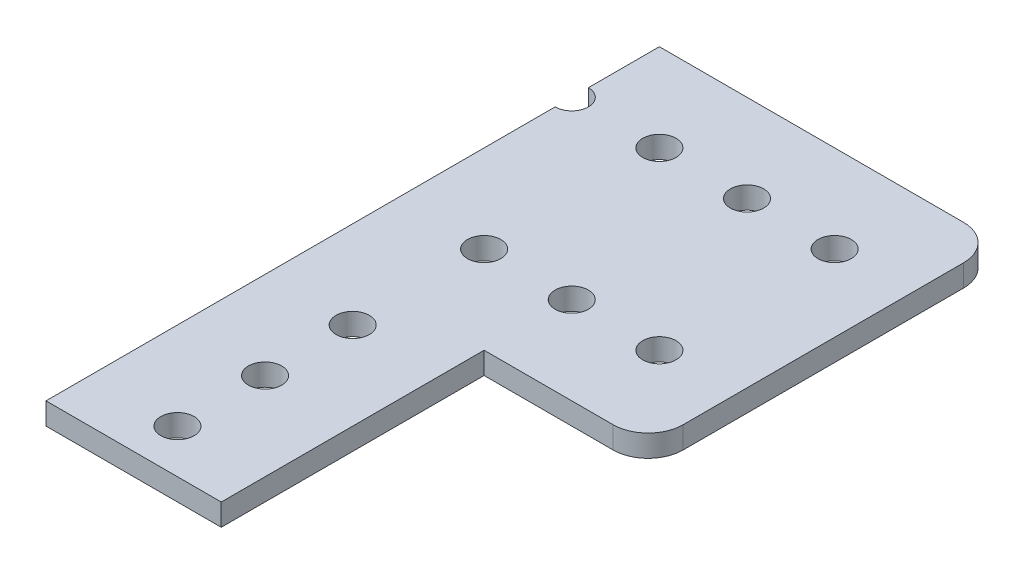
ISO-10303-21;
HEADER;
FILE_DESCRIPTION(('STEP AP214'),'2;1');
FILE_NAME('part.step','',(''),(''),'','','');
FILE_SCHEMA(('AUTOMOTIVE_DESIGN { 1 0 10303 214 1 1 1 1 }'));
ENDSEC;
DATA;
#1=APPLICATION_CONTEXT('core data for automotive mechanical design processes');
#2=APPLICATION_PROTOCOL_DEFINITION('international standard','automotive_design',2000,#1);
#3=PRODUCT_CONTEXT('',#1,'mechanical');
#4=PRODUCT('Part','Part','',(#3));
#5=PRODUCT_RELATED_PRODUCT_CATEGORY('part','',(#4));
#6=PRODUCT_DEFINITION_FORMATION('','',#4);
#7=PRODUCT_DEFINITION_CONTEXT('part definition',#1,'design');
#8=PRODUCT_DEFINITION('design','',#6,#7);
#9=PRODUCT_DEFINITION_SHAPE('','',#8);
#10=(LENGTH_UNIT() NAMED_UNIT(*) SI_UNIT(.MILLI.,.METRE.));
#11=(NAMED_UNIT(*) PLANE_ANGLE_UNIT() SI_UNIT($,.RADIAN.));
#12=(NAMED_UNIT(*) SI_UNIT($,.STERADIAN.) SOLID_ANGLE_UNIT());
#13=UNCERTAINTY_MEASURE_WITH_UNIT(LENGTH_MEASURE(1.E-05),#10,'distance_accuracy_value','');
#14=(GEOMETRIC_REPRESENTATION_CONTEXT(3) GLOBAL_UNCERTAINTY_ASSIGNED_CONTEXT((#13)) GLOBAL_UNIT_ASSIGNED_CONTEXT((#10,
#11,#12)) REPRESENTATION_CONTEXT('',''));
#15=CARTESIAN_POINT('',(0.,0.,0.));
#16=DIRECTION('',(0.,0.,1.));
#17=DIRECTION('',(1.,0.,0.));
#18=AXIS2_PLACEMENT_3D('',#15,#16,#17);
#19=CARTESIAN_POINT('',(0.,3.175,0.));
#20=DIRECTION('',(1.,0.,0.));
#21=DIRECTION('',(0.,0.,-1.));
#22=AXIS2_PLACEMENT_3D('',#19,#20,#21);
#23=PLANE('',#22);
#24=DIRECTION('',(0.,0.,1.));
#25=VECTOR('',#24,1.);
#26=CARTESIAN_POINT('',(0.,0.,0.));
#27=LINE('',#26,#25);
#28=CARTESIAN_POINT('',(0.,0.,-86.487000321718));
#29=VERTEX_POINT('',#28);
#30=CARTESIAN_POINT('',(0.,0.,-12.7));
#31=VERTEX_POINT('',#30);
#32=EDGE_CURVE('E220',#29,#31,#27,.T.);
#33=ORIENTED_EDGE('',*,*,#32,.T.);
#34=DIRECTION('',(0.,1.,0.));
#35=VECTOR('',#34,1.);
#36=CARTESIAN_POINT('',(0.,0.,-12.7));
#37=LINE('',#36,#35);
#38=CARTESIAN_POINT('',(0.,3.175,-12.7));
#39=VERTEX_POINT('',#38);
#40=EDGE_CURVE('E223',#31,#39,#37,.T.);
#41=ORIENTED_EDGE('',*,*,#40,.T.);
#42=DIRECTION('',(0.,0.,1.));
#43=VECTOR('',#42,1.);
#44=CARTESIAN_POINT('',(0.,3.175,0.));
#45=LINE('',#44,#43);
#46=CARTESIAN_POINT('',(0.,3.175,-86.487000321718));
#47=VERTEX_POINT('',#46);
#48=EDGE_CURVE('E48',#47,#39,#45,.T.);
#49=ORIENTED_EDGE('',*,*,#48,.F.);
#50=DIRECTION('',(0.,1.,0.));
#51=VECTOR('',#50,1.);
#52=CARTESIAN_POINT('',(0.,0.,-86.487000321718));
#53=LINE('',#52,#51);
#54=EDGE_CURVE('E41',#29,#47,#53,.T.);
#55=ORIENTED_EDGE('',*,*,#54,.F.);
#56=EDGE_LOOP('',(#33,#41,#49,#55));
#57=FACE_BOUND('',#56,.T.);
#58=ADVANCED_FACE('F33',(#57),#23,.F.);
#59=CARTESIAN_POINT('',(25.4,3.175,0.));
#60=DIRECTION('',(-1.,0.,0.));
#61=DIRECTION('',(0.,0.,1.));
#62=AXIS2_PLACEMENT_3D('',#59,#60,#61);
#63=PLANE('',#62);
#64=DIRECTION('',(0.,0.,-1.));
#65=VECTOR('',#64,1.);
#66=CARTESIAN_POINT('',(25.4,3.175,0.));
#67=LINE('',#66,#65);
#68=CARTESIAN_POINT('',(25.4,3.175,-12.7));
#69=VERTEX_POINT('',#68);
#70=CARTESIAN_POINT('',(25.4,3.175,-50.8));
#71=VERTEX_POINT('',#70);
#72=EDGE_CURVE('E134',#69,#71,#67,.T.);
#73=ORIENTED_EDGE('',*,*,#72,.F.);
#74=DIRECTION('',(0.,1.,0.));
#75=VECTOR('',#74,1.);
#76=CARTESIAN_POINT('',(25.4,0.,-12.7));
#77=LINE('',#76,#75);
#78=CARTESIAN_POINT('',(25.4,0.,-12.7));
#79=VERTEX_POINT('',#78);
#80=EDGE_CURVE('E437',#79,#69,#77,.T.);
#81=ORIENTED_EDGE('',*,*,#80,.F.);
#82=DIRECTION('',(0.,0.,-1.));
#83=VECTOR('',#82,1.);
#84=CARTESIAN_POINT('',(25.4,0.,0.));
#85=LINE('',#84,#83);
#86=CARTESIAN_POINT('',(25.4,0.,-50.8));
#87=VERTEX_POINT('',#86);
#88=EDGE_CURVE('E222',#79,#87,#85,.T.);
#89=ORIENTED_EDGE('',*,*,#88,.T.);
#90=DIRECTION('',(0.,-1.,0.));
#91=VECTOR('',#90,1.);
#92=CARTESIAN_POINT('',(25.4,3.175,-50.8));
#93=LINE('',#92,#91);
#94=EDGE_CURVE('E141',#71,#87,#93,.T.);
#95=ORIENTED_EDGE('',*,*,#94,.F.);
#96=EDGE_LOOP('',(#73,#81,#89,#95));
#97=FACE_BOUND('',#96,.T.);
#98=ADVANCED_FACE('F253',(#97),#63,.F.);
#99=CARTESIAN_POINT('',(25.4,3.175,-50.8));
#100=DIRECTION('',(0.,0.,-1.));
#101=DIRECTION('',(-1.,0.,0.));
#102=AXIS2_PLACEMENT_3D('',#99,#100,#101);
#103=PLANE('',#102);
#104=DIRECTION('',(1.,0.,0.));
#105=VECTOR('',#104,1.);
#106=CARTESIAN_POINT('',(25.4,0.,-50.8));
#107=LINE('',#106,#105);
#108=CARTESIAN_POINT('',(44.0905660377358,0.,-50.8));
#109=VERTEX_POINT('',#108);
#110=EDGE_CURVE('E137',#87,#109,#107,.T.);
#111=ORIENTED_EDGE('',*,*,#110,.T.);
#112=DIRECTION('',(0.,-1.,0.));
#113=VECTOR('',#112,1.);
#114=CARTESIAN_POINT('',(44.0905660377358,3.175,-50.8));
#115=LINE('',#114,#113);
#116=CARTESIAN_POINT('',(44.0905660377358,3.175,-50.8));
#117=VERTEX_POINT('',#116);
#118=EDGE_CURVE('E158',#109,#117,#115,.F.);
#119=ORIENTED_EDGE('',*,*,#118,.T.);
#120=DIRECTION('',(1.,0.,0.));
#121=VECTOR('',#120,1.);
#122=CARTESIAN_POINT('',(25.4,3.175,-50.8));
#123=LINE('',#122,#121);
#124=EDGE_CURVE('E213',#71,#117,#123,.T.);
#125=ORIENTED_EDGE('',*,*,#124,.F.);
#126=ORIENTED_EDGE('',*,*,#94,.T.);
#127=EDGE_LOOP('',(#111,#119,#125,#126));
#128=FACE_BOUND('',#127,.T.);
#129=ADVANCED_FACE('F228',(#128),#103,.F.);
#130=CARTESIAN_POINT('',(49.1705660377358,3.175,-50.8));
#131=DIRECTION('',(-1.,0.,0.));
#132=DIRECTION('',(0.,0.,1.));
#133=AXIS2_PLACEMENT_3D('',#130,#131,#132);
#134=PLANE('',#133);
#135=DIRECTION('',(0.,0.,-1.));
#136=VECTOR('',#135,1.);
#137=CARTESIAN_POINT('',(49.1705660377358,3.175,-50.8));
#138=LINE('',#137,#136);
#139=CARTESIAN_POINT('',(49.1705660377358,3.175,-55.88));
#140=VERTEX_POINT('',#139);
#141=CARTESIAN_POINT('',(49.1705660377358,3.175,-96.52));
#142=VERTEX_POINT('',#141);
#143=EDGE_CURVE('E216',#140,#142,#138,.T.);
#144=ORIENTED_EDGE('',*,*,#143,.F.);
#145=DIRECTION('',(0.,-1.,0.));
#146=VECTOR('',#145,1.);
#147=CARTESIAN_POINT('',(49.1705660377358,3.175,-55.88));
#148=LINE('',#147,#146);
#149=CARTESIAN_POINT('',(49.1705660377358,0.,-55.88));
#150=VERTEX_POINT('',#149);
#151=EDGE_CURVE('E155',#140,#150,#148,.T.);
#152=ORIENTED_EDGE('',*,*,#151,.T.);
#153=DIRECTION('',(0.,0.,-1.));
#154=VECTOR('',#153,1.);
#155=CARTESIAN_POINT('',(49.1705660377358,0.,-50.8));
#156=LINE('',#155,#154);
#157=CARTESIAN_POINT('',(49.1705660377358,0.,-96.52));
#158=VERTEX_POINT('',#157);
#159=EDGE_CURVE('E132',#150,#158,#156,.T.);
#160=ORIENTED_EDGE('',*,*,#159,.T.);
#161=DIRECTION('',(0.,-1.,0.));
#162=VECTOR('',#161,1.);
#163=CARTESIAN_POINT('',(49.1705660377358,3.175,-96.52));
#164=LINE('',#163,#162);
#165=EDGE_CURVE('E153',#158,#142,#164,.F.);
#166=ORIENTED_EDGE('',*,*,#165,.T.);
#167=EDGE_LOOP('',(#144,#152,#160,#166));
#168=FACE_BOUND('',#167,.T.);
#169=ADVANCED_FACE('F239',(#168),#134,.F.);
#170=CARTESIAN_POINT('',(-27.0294339622642,3.175,-101.6));
#171=DIRECTION('',(0.,0.,1.));
#172=DIRECTION('',(1.,0.,0.));
#173=AXIS2_PLACEMENT_3D('',#170,#171,#172);
#174=PLANE('',#173);
#175=DIRECTION('',(-1.,0.,0.));
#176=VECTOR('',#175,1.);
#177=CARTESIAN_POINT('',(-27.0294339622642,0.,-101.6));
#178=LINE('',#177,#176);
#179=CARTESIAN_POINT('',(44.0905660377358,0.,-101.6));
#180=VERTEX_POINT('',#179);
#181=CARTESIAN_POINT('',(0.,0.,-101.6));
#182=VERTEX_POINT('',#181);
#183=EDGE_CURVE('E124',#180,#182,#178,.T.);
#184=ORIENTED_EDGE('',*,*,#183,.T.);
#185=DIRECTION('',(0.,1.,0.));
#186=VECTOR('',#185,1.);
#187=CARTESIAN_POINT('',(0.,0.,-101.6));
#188=LINE('',#187,#186);
#189=CARTESIAN_POINT('',(0.,3.175,-101.6));
#190=VERTEX_POINT('',#189);
#191=EDGE_CURVE('E109',#182,#190,#188,.T.);
#192=ORIENTED_EDGE('',*,*,#191,.T.);
#193=DIRECTION('',(-1.,0.,0.));
#194=VECTOR('',#193,1.);
#195=CARTESIAN_POINT('',(-27.0294339622642,3.175,-101.6));
#196=LINE('',#195,#194);
#197=CARTESIAN_POINT('',(44.0905660377358,3.175,-101.6));
#198=VERTEX_POINT('',#197);
#199=EDGE_CURVE('E145',#198,#190,#196,.T.);
#200=ORIENTED_EDGE('',*,*,#199,.F.);
#201=DIRECTION('',(0.,-1.,0.));
#202=VECTOR('',#201,1.);
#203=CARTESIAN_POINT('',(44.0905660377358,3.175,-101.6));
#204=LINE('',#203,#202);
#205=EDGE_CURVE('E131',#198,#180,#204,.T.);
#206=ORIENTED_EDGE('',*,*,#205,.T.);
#207=EDGE_LOOP('',(#184,#192,#200,#206));
#208=FACE_BOUND('',#207,.T.);
#209=ADVANCED_FACE('F129',(#208),#174,.F.);
#210=CARTESIAN_POINT('',(0.,3.175,0.));
#211=DIRECTION('',(0.,-1.,0.));
#212=DIRECTION('',(0.,0.,-1.));
#213=AXIS2_PLACEMENT_3D('',#210,#211,#212);
#214=PLANE('',#213);
#215=CARTESIAN_POINT('',(38.1012460377358,3.175,-63.5000000000002));
#216=DIRECTION('',(0.,1.,0.));
#217=DIRECTION('',(0.,0.,1.));
#218=AXIS2_PLACEMENT_3D('',#215,#216,#217);
#219=CIRCLE('',#218,2.413);
#220=CARTESIAN_POINT('',(38.1012460377358,3.175,-61.0870000000002));
#221=VERTEX_POINT('',#220);
#222=EDGE_CURVE('E117',#221,#221,#219,.T.);
#223=ORIENTED_EDGE('',*,*,#222,.F.);
#224=EDGE_LOOP('',(#223));
#225=FACE_BOUND('',#224,.T.);
#226=CARTESIAN_POINT('',(25.4012460377358,3.175,-63.5000000000002));
#227=DIRECTION('',(0.,1.,0.));
#228=DIRECTION('',(0.,0.,1.));
#229=AXIS2_PLACEMENT_3D('',#226,#227,#228);
#230=CIRCLE('',#229,2.41299999999999);
#231=CARTESIAN_POINT('',(25.4012460377358,3.175,-61.0870000000002));
#232=VERTEX_POINT('',#231);
#233=EDGE_CURVE('E453',#232,#232,#230,.T.);
#234=ORIENTED_EDGE('',*,*,#233,.F.);
#235=EDGE_LOOP('',(#234));
#236=FACE_BOUND('',#235,.T.);
#237=CARTESIAN_POINT('',(12.7012460377358,3.175,-63.5000000000002));
#238=DIRECTION('',(0.,1.,0.));
#239=DIRECTION('',(0.,0.,1.));
#240=AXIS2_PLACEMENT_3D('',#237,#238,#239);
#241=CIRCLE('',#240,2.413);
#242=CARTESIAN_POINT('',(12.7012460377358,3.175,-61.0870000000002));
#243=VERTEX_POINT('',#242);
#244=EDGE_CURVE('E447',#243,#243,#241,.T.);
#245=ORIENTED_EDGE('',*,*,#244,.F.);
#246=EDGE_LOOP('',(#245));
#247=FACE_BOUND('',#246,.T.);
#248=CARTESIAN_POINT('',(12.7,3.175,-19.05));
#249=DIRECTION('',(0.,1.,0.));
#250=DIRECTION('',(0.,0.,1.));
#251=AXIS2_PLACEMENT_3D('',#248,#249,#250);
#252=CIRCLE('',#251,2.413);
#253=CARTESIAN_POINT('',(12.7,3.175,-16.637));
#254=VERTEX_POINT('',#253);
#255=EDGE_CURVE('E198',#254,#254,#252,.T.);
#256=ORIENTED_EDGE('',*,*,#255,.F.);
#257=EDGE_LOOP('',(#256));
#258=FACE_BOUND('',#257,.T.);
#259=CARTESIAN_POINT('',(12.7,3.175,-31.75));
#260=DIRECTION('',(0.,1.,0.));
#261=DIRECTION('',(0.,0.,1.));
#262=AXIS2_PLACEMENT_3D('',#259,#260,#261);
#263=CIRCLE('',#262,2.413);
#264=CARTESIAN_POINT('',(12.7,3.175,-29.337));
#265=VERTEX_POINT('',#264);
#266=EDGE_CURVE('E204',#265,#265,#263,.T.);
#267=ORIENTED_EDGE('',*,*,#266,.F.);
#268=EDGE_LOOP('',(#267));
#269=FACE_BOUND('',#268,.T.);
#270=CARTESIAN_POINT('',(12.7,3.175,-44.45));
#271=DIRECTION('',(0.,1.,0.));
#272=DIRECTION('',(0.,0.,1.));
#273=AXIS2_PLACEMENT_3D('',#270,#271,#272);
#274=CIRCLE('',#273,2.413);
#275=CARTESIAN_POINT('',(12.7,3.175,-42.037));
#276=VERTEX_POINT('',#275);
#277=EDGE_CURVE('E172',#276,#276,#274,.T.);
#278=ORIENTED_EDGE('',*,*,#277,.F.);
#279=EDGE_LOOP('',(#278));
#280=FACE_BOUND('',#279,.T.);
#281=ORIENTED_EDGE('',*,*,#199,.T.);
#282=DIRECTION('',(0.,0.,-1.));
#283=VECTOR('',#282,1.);
#284=CARTESIAN_POINT('',(0.,3.175,-50.8));
#285=LINE('',#284,#283);
#286=CARTESIAN_POINT('',(0.,3.175,-91.3129996782824));
#287=VERTEX_POINT('',#286);
#288=EDGE_CURVE('E112',#287,#190,#285,.T.);
#289=ORIENTED_EDGE('',*,*,#288,.F.);
#290=CARTESIAN_POINT('',(0.00124603773582824,3.175,-88.9000000000002));
#291=DIRECTION('',(0.,1.,0.));
#292=DIRECTION('',(0.,0.,1.));
#293=AXIS2_PLACEMENT_3D('',#290,#291,#292);
#294=CIRCLE('',#293,2.413);
#295=EDGE_CURVE('E164',#47,#287,#294,.T.);
#296=ORIENTED_EDGE('',*,*,#295,.F.);
#297=ORIENTED_EDGE('',*,*,#48,.T.);
#298=DIRECTION('',(-1.,0.,0.));
#299=VECTOR('',#298,1.);
#300=CARTESIAN_POINT('',(0.,3.175,-12.7));
#301=LINE('',#300,#299);
#302=EDGE_CURVE('E197',#69,#39,#301,.T.);
#303=ORIENTED_EDGE('',*,*,#302,.F.);
#304=ORIENTED_EDGE('',*,*,#72,.T.);
#305=ORIENTED_EDGE('',*,*,#124,.T.);
#306=CARTESIAN_POINT('',(44.0905660377358,3.175,-55.88));
#307=DIRECTION('',(0.,-1.,0.));
#308=DIRECTION('',(0.,0.,-1.));
#309=AXIS2_PLACEMENT_3D('',#306,#307,#308);
#310=CIRCLE('',#309,5.08);
#311=EDGE_CURVE('E151',#117,#140,#310,.F.);
#312=ORIENTED_EDGE('',*,*,#311,.T.);
#313=ORIENTED_EDGE('',*,*,#143,.T.);
#314=CARTESIAN_POINT('',(44.0905660377358,3.175,-96.52));
#315=DIRECTION('',(0.,-1.,0.));
#316=DIRECTION('',(0.,0.,-1.));
#317=AXIS2_PLACEMENT_3D('',#314,#315,#316);
#318=CIRCLE('',#317,5.08);
#319=EDGE_CURVE('E149',#142,#198,#318,.F.);
#320=ORIENTED_EDGE('',*,*,#319,.T.);
#321=EDGE_LOOP('',(#281,#289,#296,#297,#303,#304,#305,#312,#313,#320));
#322=FACE_BOUND('',#321,.T.);
#323=CARTESIAN_POINT('',(12.7012460377358,3.175,-88.9000000000002));
#324=DIRECTION('',(0.,1.,0.));
#325=DIRECTION('',(0.,0.,1.));
#326=AXIS2_PLACEMENT_3D('',#323,#324,#325);
#327=CIRCLE('',#326,2.413);
#328=CARTESIAN_POINT('',(12.7012460377358,3.175,-86.4870000000002));
#329=VERTEX_POINT('',#328);
#330=EDGE_CURVE('E175',#329,#329,#327,.T.);
#331=ORIENTED_EDGE('',*,*,#330,.F.);
#332=EDGE_LOOP('',(#331));
#333=FACE_BOUND('',#332,.T.);
#334=CARTESIAN_POINT('',(25.4012460377358,3.175,-88.9000000000002));
#335=DIRECTION('',(0.,1.,0.));
#336=DIRECTION('',(0.,0.,1.));
#337=AXIS2_PLACEMENT_3D('',#334,#335,#336);
#338=CIRCLE('',#337,2.41299999999999);
#339=CARTESIAN_POINT('',(25.4012460377358,3.175,-86.4870000000002));
#340=VERTEX_POINT('',#339);
#341=EDGE_CURVE('E184',#340,#340,#338,.T.);
#342=ORIENTED_EDGE('',*,*,#341,.F.);
#343=EDGE_LOOP('',(#342));
#344=FACE_BOUND('',#343,.T.);
#345=CARTESIAN_POINT('',(38.1012460377358,3.175,-88.9000000000002));
#346=DIRECTION('',(0.,1.,0.));
#347=DIRECTION('',(0.,0.,1.));
#348=AXIS2_PLACEMENT_3D('',#345,#346,#347);
#349=CIRCLE('',#348,2.41299999999999);
#350=CARTESIAN_POINT('',(38.1012460377358,3.175,-86.4870000000002));
#351=VERTEX_POINT('',#350);
#352=EDGE_CURVE('E190',#351,#351,#349,.T.);
#353=ORIENTED_EDGE('',*,*,#352,.F.);
#354=EDGE_LOOP('',(#353));
#355=FACE_BOUND('',#354,.T.);
#356=ADVANCED_FACE('F167',(#225,#236,#247,#258,#269,#280,#322,#333,#344,#355),#214,.F.);
#357=CARTESIAN_POINT('',(0.,0.,0.));
#358=DIRECTION('',(0.,-1.,0.));
#359=DIRECTION('',(0.,0.,-1.));
#360=AXIS2_PLACEMENT_3D('',#357,#358,#359);
#361=PLANE('',#360);
#362=DIRECTION('',(0.,0.,-1.));
#363=VECTOR('',#362,1.);
#364=CARTESIAN_POINT('',(0.,0.,-50.8));
#365=LINE('',#364,#363);
#366=CARTESIAN_POINT('',(0.,0.,-91.3129996782824));
#367=VERTEX_POINT('',#366);
#368=EDGE_CURVE('E56',#367,#182,#365,.T.);
#369=ORIENTED_EDGE('',*,*,#368,.T.);
#370=ORIENTED_EDGE('',*,*,#183,.F.);
#371=CARTESIAN_POINT('',(44.0905660377358,0.,-96.52));
#372=DIRECTION('',(0.,-1.,0.));
#373=DIRECTION('',(0.,0.,-1.));
#374=AXIS2_PLACEMENT_3D('',#371,#372,#373);
#375=CIRCLE('',#374,5.08);
#376=EDGE_CURVE('E144',#180,#158,#375,.T.);
#377=ORIENTED_EDGE('',*,*,#376,.T.);
#378=ORIENTED_EDGE('',*,*,#159,.F.);
#379=CARTESIAN_POINT('',(44.0905660377358,0.,-55.88));
#380=DIRECTION('',(0.,-1.,0.));
#381=DIRECTION('',(0.,0.,-1.));
#382=AXIS2_PLACEMENT_3D('',#379,#380,#381);
#383=CIRCLE('',#382,5.08);
#384=EDGE_CURVE('E147',#150,#109,#383,.T.);
#385=ORIENTED_EDGE('',*,*,#384,.T.);
#386=ORIENTED_EDGE('',*,*,#110,.F.);
#387=ORIENTED_EDGE('',*,*,#88,.F.);
#388=DIRECTION('',(-1.,0.,0.));
#389=VECTOR('',#388,1.);
#390=CARTESIAN_POINT('',(0.,0.,-12.7));
#391=LINE('',#390,#389);
#392=EDGE_CURVE('E439',#79,#31,#391,.T.);
#393=ORIENTED_EDGE('',*,*,#392,.T.);
#394=ORIENTED_EDGE('',*,*,#32,.F.);
#395=CARTESIAN_POINT('',(0.00124603773582824,0.,-88.9000000000002));
#396=DIRECTION('',(0.,1.,0.));
#397=DIRECTION('',(0.,0.,1.));
#398=AXIS2_PLACEMENT_3D('',#395,#396,#397);
#399=CIRCLE('',#398,2.413);
#400=EDGE_CURVE('E126',#29,#367,#399,.T.);
#401=ORIENTED_EDGE('',*,*,#400,.T.);
#402=EDGE_LOOP('',(#369,#370,#377,#378,#385,#386,#387,#393,#394,#401));
#403=FACE_BOUND('',#402,.T.);
#404=CARTESIAN_POINT('',(38.1012460377358,0.,-63.5000000000002));
#405=DIRECTION('',(0.,1.,0.));
#406=DIRECTION('',(0.,0.,1.));
#407=AXIS2_PLACEMENT_3D('',#404,#405,#406);
#408=CIRCLE('',#407,2.413);
#409=CARTESIAN_POINT('',(38.1012460377358,0.,-61.0870000000002));
#410=VERTEX_POINT('',#409);
#411=EDGE_CURVE('E456',#410,#410,#408,.T.);
#412=ORIENTED_EDGE('',*,*,#411,.T.);
#413=EDGE_LOOP('',(#412));
#414=FACE_BOUND('',#413,.T.);
#415=CARTESIAN_POINT('',(25.4012460377358,0.,-63.5000000000002));
#416=DIRECTION('',(0.,1.,0.));
#417=DIRECTION('',(0.,0.,1.));
#418=AXIS2_PLACEMENT_3D('',#415,#416,#417);
#419=CIRCLE('',#418,2.41299999999999);
#420=CARTESIAN_POINT('',(25.4012460377358,0.,-61.0870000000002));
#421=VERTEX_POINT('',#420);
#422=EDGE_CURVE('E450',#421,#421,#419,.T.);
#423=ORIENTED_EDGE('',*,*,#422,.T.);
#424=EDGE_LOOP('',(#423));
#425=FACE_BOUND('',#424,.T.);
#426=CARTESIAN_POINT('',(12.7012460377358,0.,-63.5000000000002));
#427=DIRECTION('',(0.,1.,0.));
#428=DIRECTION('',(0.,0.,1.));
#429=AXIS2_PLACEMENT_3D('',#426,#427,#428);
#430=CIRCLE('',#429,2.413);
#431=CARTESIAN_POINT('',(12.7012460377358,0.,-61.0870000000002));
#432=VERTEX_POINT('',#431);
#433=EDGE_CURVE('E193',#432,#432,#430,.T.);
#434=ORIENTED_EDGE('',*,*,#433,.T.);
#435=EDGE_LOOP('',(#434));
#436=FACE_BOUND('',#435,.T.);
#437=CARTESIAN_POINT('',(12.7,0.,-19.05));
#438=DIRECTION('',(0.,1.,0.));
#439=DIRECTION('',(0.,0.,1.));
#440=AXIS2_PLACEMENT_3D('',#437,#438,#439);
#441=CIRCLE('',#440,2.413);
#442=CARTESIAN_POINT('',(12.7,0.,-16.637));
#443=VERTEX_POINT('',#442);
#444=EDGE_CURVE('E194',#443,#443,#441,.T.);
#445=ORIENTED_EDGE('',*,*,#444,.T.);
#446=EDGE_LOOP('',(#445));
#447=FACE_BOUND('',#446,.T.);
#448=CARTESIAN_POINT('',(12.7,0.,-31.75));
#449=DIRECTION('',(0.,1.,0.));
#450=DIRECTION('',(0.,0.,1.));
#451=AXIS2_PLACEMENT_3D('',#448,#449,#450);
#452=CIRCLE('',#451,2.413);
#453=CARTESIAN_POINT('',(12.7,0.,-29.337));
#454=VERTEX_POINT('',#453);
#455=EDGE_CURVE('E201',#454,#454,#452,.T.);
#456=ORIENTED_EDGE('',*,*,#455,.T.);
#457=EDGE_LOOP('',(#456));
#458=FACE_BOUND('',#457,.T.);
#459=CARTESIAN_POINT('',(12.7,0.,-44.45));
#460=DIRECTION('',(0.,1.,0.));
#461=DIRECTION('',(0.,0.,1.));
#462=AXIS2_PLACEMENT_3D('',#459,#460,#461);
#463=CIRCLE('',#462,2.413);
#464=CARTESIAN_POINT('',(12.7,0.,-42.037));
#465=VERTEX_POINT('',#464);
#466=EDGE_CURVE('E207',#465,#465,#463,.T.);
#467=ORIENTED_EDGE('',*,*,#466,.T.);
#468=EDGE_LOOP('',(#467));
#469=FACE_BOUND('',#468,.T.);
#470=CARTESIAN_POINT('',(12.7012460377358,0.,-88.9000000000002));
#471=DIRECTION('',(0.,1.,0.));
#472=DIRECTION('',(0.,0.,1.));
#473=AXIS2_PLACEMENT_3D('',#470,#471,#472);
#474=CIRCLE('',#473,2.413);
#475=CARTESIAN_POINT('',(12.7012460377358,0.,-86.4870000000002));
#476=VERTEX_POINT('',#475);
#477=EDGE_CURVE('E170',#476,#476,#474,.T.);
#478=ORIENTED_EDGE('',*,*,#477,.T.);
#479=EDGE_LOOP('',(#478));
#480=FACE_BOUND('',#479,.T.);
#481=CARTESIAN_POINT('',(25.4012460377358,0.,-88.9000000000002));
#482=DIRECTION('',(0.,1.,0.));
#483=DIRECTION('',(0.,0.,1.));
#484=AXIS2_PLACEMENT_3D('',#481,#482,#483);
#485=CIRCLE('',#484,2.41299999999999);
#486=CARTESIAN_POINT('',(25.4012460377358,0.,-86.4870000000002));
#487=VERTEX_POINT('',#486);
#488=EDGE_CURVE('E181',#487,#487,#485,.T.);
#489=ORIENTED_EDGE('',*,*,#488,.T.);
#490=EDGE_LOOP('',(#489));
#491=FACE_BOUND('',#490,.T.);
#492=CARTESIAN_POINT('',(38.1012460377358,0.,-88.9000000000002));
#493=DIRECTION('',(0.,1.,0.));
#494=DIRECTION('',(0.,0.,1.));
#495=AXIS2_PLACEMENT_3D('',#492,#493,#494);
#496=CIRCLE('',#495,2.41299999999999);
#497=CARTESIAN_POINT('',(38.1012460377358,0.,-86.4870000000002));
#498=VERTEX_POINT('',#497);
#499=EDGE_CURVE('E187',#498,#498,#496,.T.);
#500=ORIENTED_EDGE('',*,*,#499,.T.);
#501=EDGE_LOOP('',(#500));
#502=FACE_BOUND('',#501,.T.);
#503=ADVANCED_FACE('F122',(#403,#414,#425,#436,#447,#458,#469,#480,#491,#502),#361,.T.);
#504=CARTESIAN_POINT('',(44.0905660377358,3.175,-55.88));
#505=DIRECTION('',(0.,-1.,0.));
#506=DIRECTION('',(0.,0.,-1.));
#507=AXIS2_PLACEMENT_3D('',#504,#505,#506);
#508=CYLINDRICAL_SURFACE('',#507,5.08);
#509=ORIENTED_EDGE('',*,*,#311,.F.);
#510=ORIENTED_EDGE('',*,*,#118,.F.);
#511=ORIENTED_EDGE('',*,*,#384,.F.);
#512=ORIENTED_EDGE('',*,*,#151,.F.);
#513=EDGE_LOOP('',(#509,#510,#511,#512));
#514=FACE_BOUND('',#513,.T.);
#515=ADVANCED_FACE('F234',(#514),#508,.T.);
#516=CARTESIAN_POINT('',(44.0905660377358,3.175,-96.52));
#517=DIRECTION('',(0.,-1.,0.));
#518=DIRECTION('',(0.,0.,-1.));
#519=AXIS2_PLACEMENT_3D('',#516,#517,#518);
#520=CYLINDRICAL_SURFACE('',#519,5.08);
#521=ORIENTED_EDGE('',*,*,#319,.F.);
#522=ORIENTED_EDGE('',*,*,#165,.F.);
#523=ORIENTED_EDGE('',*,*,#376,.F.);
#524=ORIENTED_EDGE('',*,*,#205,.F.);
#525=EDGE_LOOP('',(#521,#522,#523,#524));
#526=FACE_BOUND('',#525,.T.);
#527=ADVANCED_FACE('F35',(#526),#520,.T.);
#528=CARTESIAN_POINT('',(38.1012460377358,0.,-88.9000000000002));
#529=DIRECTION('',(0.,1.,0.));
#530=DIRECTION('',(0.,0.,1.));
#531=AXIS2_PLACEMENT_3D('',#528,#529,#530);
#532=CYLINDRICAL_SURFACE('',#531,2.41299999999999);
#533=ORIENTED_EDGE('',*,*,#499,.F.);
#534=EDGE_LOOP('',(#533));
#535=FACE_BOUND('',#534,.T.);
#536=ORIENTED_EDGE('',*,*,#352,.T.);
#537=EDGE_LOOP('',(#536));
#538=FACE_BOUND('',#537,.T.);
#539=ADVANCED_FACE('F244',(#535,#538),#532,.F.);
#540=CARTESIAN_POINT('',(25.4012460377358,0.,-88.9000000000002));
#541=DIRECTION('',(0.,1.,0.));
#542=DIRECTION('',(0.,0.,1.));
#543=AXIS2_PLACEMENT_3D('',#540,#541,#542);
#544=CYLINDRICAL_SURFACE('',#543,2.41299999999999);
#545=ORIENTED_EDGE('',*,*,#488,.F.);
#546=EDGE_LOOP('',(#545));
#547=FACE_BOUND('',#546,.T.);
#548=ORIENTED_EDGE('',*,*,#341,.T.);
#549=EDGE_LOOP('',(#548));
#550=FACE_BOUND('',#549,.T.);
#551=ADVANCED_FACE('F249',(#547,#550),#544,.F.);
#552=CARTESIAN_POINT('',(12.7012460377358,0.,-88.9000000000002));
#553=DIRECTION('',(0.,1.,0.));
#554=DIRECTION('',(0.,0.,1.));
#555=AXIS2_PLACEMENT_3D('',#552,#553,#554);
#556=CYLINDRICAL_SURFACE('',#555,2.413);
#557=ORIENTED_EDGE('',*,*,#477,.F.);
#558=EDGE_LOOP('',(#557));
#559=FACE_BOUND('',#558,.T.);
#560=ORIENTED_EDGE('',*,*,#330,.T.);
#561=EDGE_LOOP('',(#560));
#562=FACE_BOUND('',#561,.T.);
#563=ADVANCED_FACE('F287',(#559,#562),#556,.F.);
#564=CARTESIAN_POINT('',(0.00124603773582824,0.,-88.9000000000002));
#565=DIRECTION('',(0.,1.,0.));
#566=DIRECTION('',(0.,0.,1.));
#567=AXIS2_PLACEMENT_3D('',#564,#565,#566);
#568=CYLINDRICAL_SURFACE('',#567,2.413);
#569=ORIENTED_EDGE('',*,*,#295,.T.);
#570=DIRECTION('',(0.,1.,0.));
#571=VECTOR('',#570,1.);
#572=CARTESIAN_POINT('',(0.,0.,-91.3129996782824));
#573=LINE('',#572,#571);
#574=EDGE_CURVE('E11',#287,#367,#573,.F.);
#575=ORIENTED_EDGE('',*,*,#574,.T.);
#576=ORIENTED_EDGE('',*,*,#400,.F.);
#577=ORIENTED_EDGE('',*,*,#54,.T.);
#578=EDGE_LOOP('',(#569,#575,#576,#577));
#579=FACE_BOUND('',#578,.T.);
#580=ADVANCED_FACE('F163',(#579),#568,.F.);
#581=CARTESIAN_POINT('',(12.7,0.,-44.45));
#582=DIRECTION('',(0.,1.,0.));
#583=DIRECTION('',(0.,0.,1.));
#584=AXIS2_PLACEMENT_3D('',#581,#582,#583);
#585=CYLINDRICAL_SURFACE('',#584,2.413);
#586=ORIENTED_EDGE('',*,*,#466,.F.);
#587=EDGE_LOOP('',(#586));
#588=FACE_BOUND('',#587,.T.);
#589=ORIENTED_EDGE('',*,*,#277,.T.);
#590=EDGE_LOOP('',(#589));
#591=FACE_BOUND('',#590,.T.);
#592=ADVANCED_FACE('F272',(#588,#591),#585,.F.);
#593=CARTESIAN_POINT('',(12.7,0.,-31.75));
#594=DIRECTION('',(0.,1.,0.));
#595=DIRECTION('',(0.,0.,1.));
#596=AXIS2_PLACEMENT_3D('',#593,#594,#595);
#597=CYLINDRICAL_SURFACE('',#596,2.413);
#598=ORIENTED_EDGE('',*,*,#455,.F.);
#599=EDGE_LOOP('',(#598));
#600=FACE_BOUND('',#599,.T.);
#601=ORIENTED_EDGE('',*,*,#266,.T.);
#602=EDGE_LOOP('',(#601));
#603=FACE_BOUND('',#602,.T.);
#604=ADVANCED_FACE('F275',(#600,#603),#597,.F.);
#605=CARTESIAN_POINT('',(12.7,0.,-19.05));
#606=DIRECTION('',(0.,1.,0.));
#607=DIRECTION('',(0.,0.,1.));
#608=AXIS2_PLACEMENT_3D('',#605,#606,#607);
#609=CYLINDRICAL_SURFACE('',#608,2.413);
#610=ORIENTED_EDGE('',*,*,#444,.F.);
#611=EDGE_LOOP('',(#610));
#612=FACE_BOUND('',#611,.T.);
#613=ORIENTED_EDGE('',*,*,#255,.T.);
#614=EDGE_LOOP('',(#613));
#615=FACE_BOUND('',#614,.T.);
#616=ADVANCED_FACE('F279',(#612,#615),#609,.F.);
#617=CARTESIAN_POINT('',(12.7012460377358,0.,-63.5000000000002));
#618=DIRECTION('',(0.,1.,0.));
#619=DIRECTION('',(0.,0.,1.));
#620=AXIS2_PLACEMENT_3D('',#617,#618,#619);
#621=CYLINDRICAL_SURFACE('',#620,2.413);
#622=ORIENTED_EDGE('',*,*,#433,.F.);
#623=EDGE_LOOP('',(#622));
#624=FACE_BOUND('',#623,.T.);
#625=ORIENTED_EDGE('',*,*,#244,.T.);
#626=EDGE_LOOP('',(#625));
#627=FACE_BOUND('',#626,.T.);
#628=ADVANCED_FACE('F282',(#624,#627),#621,.F.);
#629=CARTESIAN_POINT('',(25.4012460377358,0.,-63.5000000000002));
#630=DIRECTION('',(0.,1.,0.));
#631=DIRECTION('',(0.,0.,1.));
#632=AXIS2_PLACEMENT_3D('',#629,#630,#631);
#633=CYLINDRICAL_SURFACE('',#632,2.41299999999999);
#634=ORIENTED_EDGE('',*,*,#422,.F.);
#635=EDGE_LOOP('',(#634));
#636=FACE_BOUND('',#635,.T.);
#637=ORIENTED_EDGE('',*,*,#233,.T.);
#638=EDGE_LOOP('',(#637));
#639=FACE_BOUND('',#638,.T.);
#640=ADVANCED_FACE('F298',(#636,#639),#633,.F.);
#641=CARTESIAN_POINT('',(38.1012460377358,0.,-63.5000000000002));
#642=DIRECTION('',(0.,1.,0.));
#643=DIRECTION('',(0.,0.,1.));
#644=AXIS2_PLACEMENT_3D('',#641,#642,#643);
#645=CYLINDRICAL_SURFACE('',#644,2.413);
#646=ORIENTED_EDGE('',*,*,#411,.F.);
#647=EDGE_LOOP('',(#646));
#648=FACE_BOUND('',#647,.T.);
#649=ORIENTED_EDGE('',*,*,#222,.T.);
#650=EDGE_LOOP('',(#649));
#651=FACE_BOUND('',#650,.T.);
#652=ADVANCED_FACE('F294',(#648,#651),#645,.F.);
#653=CARTESIAN_POINT('',(0.,0.,-12.7));
#654=DIRECTION('',(0.,0.,-1.));
#655=DIRECTION('',(-1.,0.,0.));
#656=AXIS2_PLACEMENT_3D('',#653,#654,#655);
#657=PLANE('',#656);
#658=ORIENTED_EDGE('',*,*,#302,.T.);
#659=ORIENTED_EDGE('',*,*,#40,.F.);
#660=ORIENTED_EDGE('',*,*,#392,.F.);
#661=ORIENTED_EDGE('',*,*,#80,.T.);
#662=EDGE_LOOP('',(#658,#659,#660,#661));
#663=FACE_BOUND('',#662,.T.);
#664=ADVANCED_FACE('F297',(#663),#657,.F.);
#665=CARTESIAN_POINT('',(0.,0.,-50.8));
#666=DIRECTION('',(1.,0.,0.));
#667=DIRECTION('',(0.,0.,-1.));
#668=AXIS2_PLACEMENT_3D('',#665,#666,#667);
#669=PLANE('',#668);
#670=ORIENTED_EDGE('',*,*,#288,.T.);
#671=ORIENTED_EDGE('',*,*,#191,.F.);
#672=ORIENTED_EDGE('',*,*,#368,.F.);
#673=ORIENTED_EDGE('',*,*,#574,.F.);
#674=EDGE_LOOP('',(#670,#671,#672,#673));
#675=FACE_BOUND('',#674,.T.);
#676=ADVANCED_FACE('F110',(#675),#669,.F.);
#677=CLOSED_SHELL('',(#58,#98,#129,#169,#209,#356,#503,#515,#527,#539,#551,#563,#580,#592,#604,
#616,#628,#640,#652,#664,#676));
#678=MANIFOLD_SOLID_BREP('B2',#677);
#679=ADVANCED_BREP_SHAPE_REPRESENTATION('',(#18,#678),#14);
#680=SHAPE_DEFINITION_REPRESENTATION(#9,#679);
ENDSEC;
END-ISO-10303-21;
